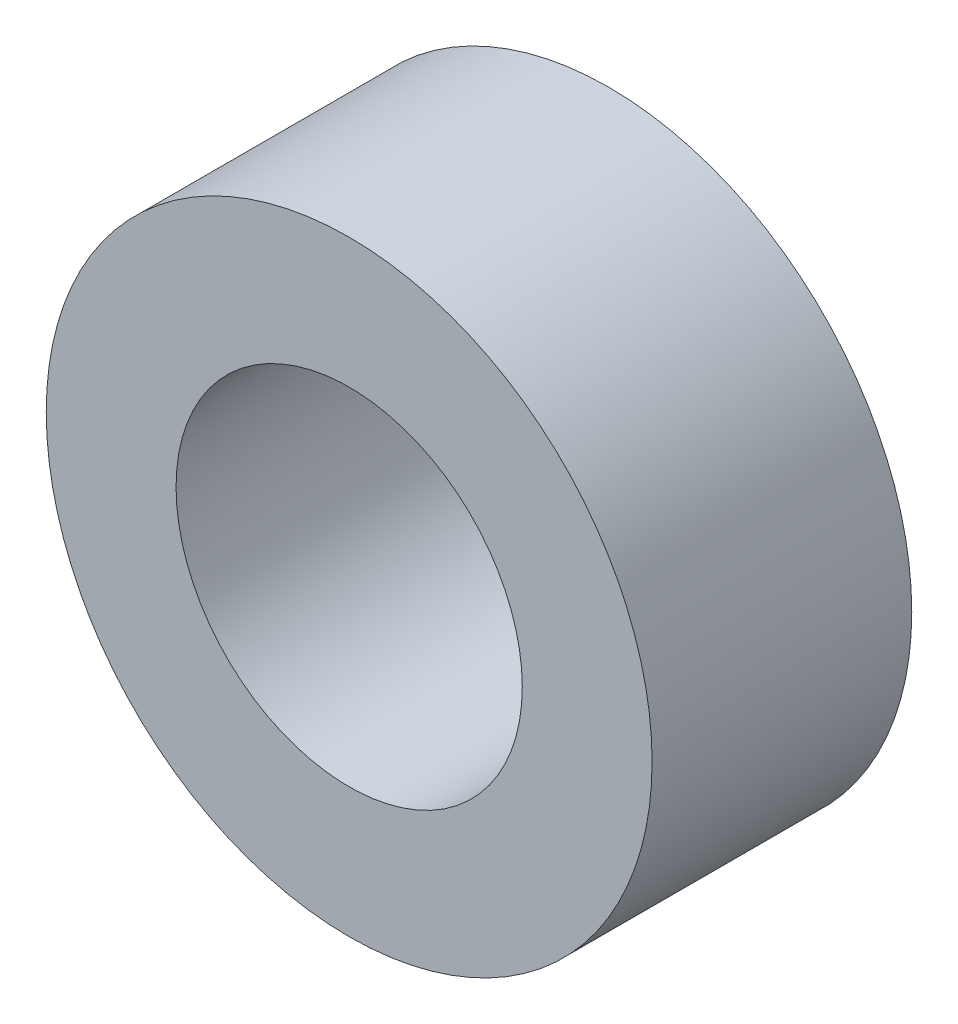
ISO-10303-21;
HEADER;
FILE_DESCRIPTION(('STEP AP214'),'2;1');
FILE_NAME('part.step','',(''),(''),'','','');
FILE_SCHEMA(('AUTOMOTIVE_DESIGN { 1 0 10303 214 1 1 1 1 }'));
ENDSEC;
DATA;
#1=APPLICATION_CONTEXT('core data for automotive mechanical design processes');
#2=APPLICATION_PROTOCOL_DEFINITION('international standard','automotive_design',2000,#1);
#3=PRODUCT_CONTEXT('',#1,'mechanical');
#4=PRODUCT('Part','Part','',(#3));
#5=PRODUCT_RELATED_PRODUCT_CATEGORY('part','',(#4));
#6=PRODUCT_DEFINITION_FORMATION('','',#4);
#7=PRODUCT_DEFINITION_CONTEXT('part definition',#1,'design');
#8=PRODUCT_DEFINITION('design','',#6,#7);
#9=PRODUCT_DEFINITION_SHAPE('','',#8);
#10=(LENGTH_UNIT() NAMED_UNIT(*) SI_UNIT(.MILLI.,.METRE.));
#11=(NAMED_UNIT(*) PLANE_ANGLE_UNIT() SI_UNIT($,.RADIAN.));
#12=(NAMED_UNIT(*) SI_UNIT($,.STERADIAN.) SOLID_ANGLE_UNIT());
#13=UNCERTAINTY_MEASURE_WITH_UNIT(LENGTH_MEASURE(1.E-05),#10,'distance_accuracy_value','');
#14=(GEOMETRIC_REPRESENTATION_CONTEXT(3) GLOBAL_UNCERTAINTY_ASSIGNED_CONTEXT((#13)) GLOBAL_UNIT_ASSIGNED_CONTEXT((#10,
#11,#12)) REPRESENTATION_CONTEXT('',''));
#15=CARTESIAN_POINT('',(0.,0.,0.));
#16=DIRECTION('',(0.,0.,1.));
#17=DIRECTION('',(1.,0.,0.));
#18=AXIS2_PLACEMENT_3D('',#15,#16,#17);
#19=CARTESIAN_POINT('',(0.,0.,3.));
#20=DIRECTION('',(0.,0.,1.));
#21=DIRECTION('',(1.,0.,0.));
#22=AXIS2_PLACEMENT_3D('',#19,#20,#21);
#23=PLANE('',#22);
#24=CARTESIAN_POINT('',(0.,0.,3.));
#25=DIRECTION('',(0.,0.,1.));
#26=DIRECTION('',(1.,0.,0.));
#27=AXIS2_PLACEMENT_3D('',#24,#25,#26);
#28=CIRCLE('',#27,3.5);
#29=CARTESIAN_POINT('',(3.5,0.,3.));
#30=VERTEX_POINT('',#29);
#31=EDGE_CURVE('E10',#30,#30,#28,.T.);
#32=ORIENTED_EDGE('',*,*,#31,.T.);
#33=EDGE_LOOP('',(#32));
#34=FACE_BOUND('',#33,.T.);
#35=CARTESIAN_POINT('',(0.,0.,3.));
#36=DIRECTION('',(0.,0.,1.));
#37=DIRECTION('',(1.,0.,0.));
#38=AXIS2_PLACEMENT_3D('',#35,#36,#37);
#39=CIRCLE('',#38,2.);
#40=CARTESIAN_POINT('',(2.,0.,3.));
#41=VERTEX_POINT('',#40);
#42=EDGE_CURVE('E42',#41,#41,#39,.T.);
#43=ORIENTED_EDGE('',*,*,#42,.F.);
#44=EDGE_LOOP('',(#43));
#45=FACE_BOUND('',#44,.T.);
#46=ADVANCED_FACE('F31',(#34,#45),#23,.T.);
#47=CARTESIAN_POINT('',(0.,0.,0.));
#48=DIRECTION('',(0.,0.,1.));
#49=DIRECTION('',(1.,0.,0.));
#50=AXIS2_PLACEMENT_3D('',#47,#48,#49);
#51=PLANE('',#50);
#52=CARTESIAN_POINT('',(0.,0.,0.));
#53=DIRECTION('',(0.,0.,1.));
#54=DIRECTION('',(1.,0.,0.));
#55=AXIS2_PLACEMENT_3D('',#52,#53,#54);
#56=CIRCLE('',#55,3.5);
#57=CARTESIAN_POINT('',(3.5,0.,0.));
#58=VERTEX_POINT('',#57);
#59=EDGE_CURVE('E35',#58,#58,#56,.T.);
#60=ORIENTED_EDGE('',*,*,#59,.F.);
#61=EDGE_LOOP('',(#60));
#62=FACE_BOUND('',#61,.T.);
#63=CARTESIAN_POINT('',(0.,0.,0.));
#64=DIRECTION('',(0.,0.,1.));
#65=DIRECTION('',(1.,0.,0.));
#66=AXIS2_PLACEMENT_3D('',#63,#64,#65);
#67=CIRCLE('',#66,2.);
#68=CARTESIAN_POINT('',(2.,0.,0.));
#69=VERTEX_POINT('',#68);
#70=EDGE_CURVE('E44',#69,#69,#67,.T.);
#71=ORIENTED_EDGE('',*,*,#70,.T.);
#72=EDGE_LOOP('',(#71));
#73=FACE_BOUND('',#72,.T.);
#74=ADVANCED_FACE('F54',(#62,#73),#51,.F.);
#75=CARTESIAN_POINT('',(0.,0.,3.));
#76=DIRECTION('',(0.,0.,-1.));
#77=DIRECTION('',(-1.,0.,0.));
#78=AXIS2_PLACEMENT_3D('',#75,#76,#77);
#79=CYLINDRICAL_SURFACE('',#78,3.5);
#80=ORIENTED_EDGE('',*,*,#31,.F.);
#81=EDGE_LOOP('',(#80));
#82=FACE_BOUND('',#81,.T.);
#83=ORIENTED_EDGE('',*,*,#59,.T.);
#84=EDGE_LOOP('',(#83));
#85=FACE_BOUND('',#84,.T.);
#86=ADVANCED_FACE('F33',(#82,#85),#79,.T.);
#87=CARTESIAN_POINT('',(0.,0.,3.));
#88=DIRECTION('',(0.,0.,-1.));
#89=DIRECTION('',(-1.,0.,0.));
#90=AXIS2_PLACEMENT_3D('',#87,#88,#89);
#91=CYLINDRICAL_SURFACE('',#90,2.);
#92=ORIENTED_EDGE('',*,*,#42,.T.);
#93=EDGE_LOOP('',(#92));
#94=FACE_BOUND('',#93,.T.);
#95=ORIENTED_EDGE('',*,*,#70,.F.);
#96=EDGE_LOOP('',(#95));
#97=FACE_BOUND('',#96,.T.);
#98=ADVANCED_FACE('F50',(#94,#97),#91,.F.);
#99=CLOSED_SHELL('',(#46,#74,#86,#98));
#100=MANIFOLD_SOLID_BREP('B2',#99);
#101=ADVANCED_BREP_SHAPE_REPRESENTATION('',(#18,#100),#14);
#102=SHAPE_DEFINITION_REPRESENTATION(#9,#101);
ENDSEC;
END-ISO-10303-21;
